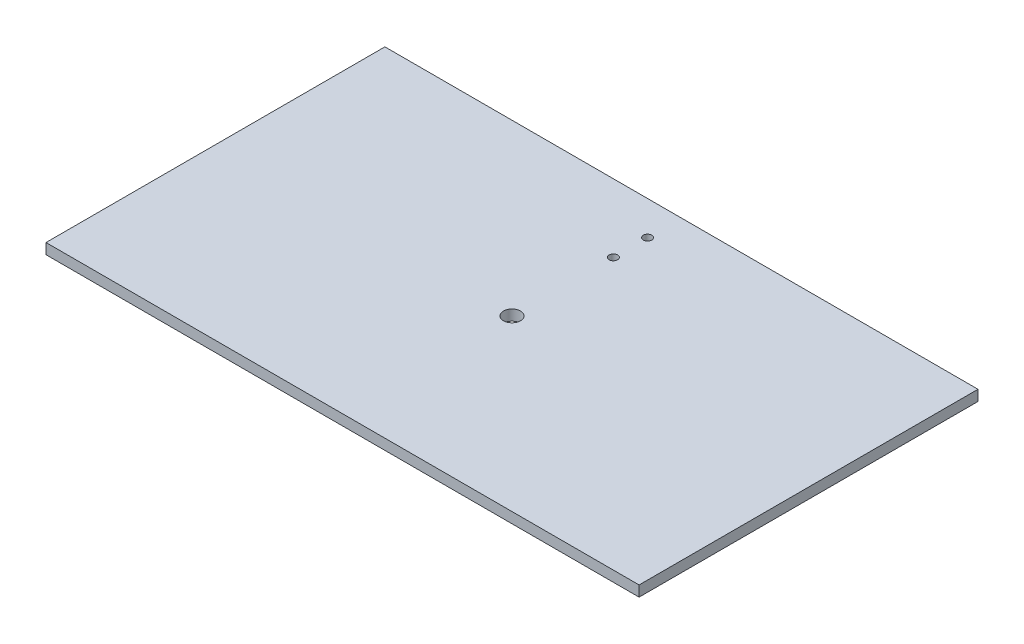
ISO-10303-21;
HEADER;
FILE_DESCRIPTION(('STEP AP214'),'2;1');
FILE_NAME('part.step','',(''),(''),'','','');
FILE_SCHEMA(('AUTOMOTIVE_DESIGN { 1 0 10303 214 1 1 1 1 }'));
ENDSEC;
DATA;
#1=APPLICATION_CONTEXT('core data for automotive mechanical design processes');
#2=APPLICATION_PROTOCOL_DEFINITION('international standard','automotive_design',2000,#1);
#3=PRODUCT_CONTEXT('',#1,'mechanical');
#4=PRODUCT('Part','Part','',(#3));
#5=PRODUCT_RELATED_PRODUCT_CATEGORY('part','',(#4));
#6=PRODUCT_DEFINITION_FORMATION('','',#4);
#7=PRODUCT_DEFINITION_CONTEXT('part definition',#1,'design');
#8=PRODUCT_DEFINITION('design','',#6,#7);
#9=PRODUCT_DEFINITION_SHAPE('','',#8);
#10=(LENGTH_UNIT() NAMED_UNIT(*) SI_UNIT(.MILLI.,.METRE.));
#11=(NAMED_UNIT(*) PLANE_ANGLE_UNIT() SI_UNIT($,.RADIAN.));
#12=(NAMED_UNIT(*) SI_UNIT($,.STERADIAN.) SOLID_ANGLE_UNIT());
#13=UNCERTAINTY_MEASURE_WITH_UNIT(LENGTH_MEASURE(1.E-05),#10,'distance_accuracy_value','');
#14=(GEOMETRIC_REPRESENTATION_CONTEXT(3) GLOBAL_UNCERTAINTY_ASSIGNED_CONTEXT((#13)) GLOBAL_UNIT_ASSIGNED_CONTEXT((#10,
#11,#12)) REPRESENTATION_CONTEXT('',''));
#15=CARTESIAN_POINT('',(0.,0.,0.));
#16=DIRECTION('',(0.,0.,1.));
#17=DIRECTION('',(1.,0.,0.));
#18=AXIS2_PLACEMENT_3D('',#15,#16,#17);
#19=CARTESIAN_POINT('',(177.8,6.35,101.6));
#20=DIRECTION('',(-1.,0.,0.));
#21=DIRECTION('',(0.,0.,1.));
#22=AXIS2_PLACEMENT_3D('',#19,#20,#21);
#23=PLANE('',#22);
#24=DIRECTION('',(0.,0.,-1.));
#25=VECTOR('',#24,1.);
#26=CARTESIAN_POINT('',(177.8,0.,101.6));
#27=LINE('',#26,#25);
#28=CARTESIAN_POINT('',(177.8,0.,101.6));
#29=VERTEX_POINT('',#28);
#30=CARTESIAN_POINT('',(177.8,0.,-101.6));
#31=VERTEX_POINT('',#30);
#32=EDGE_CURVE('E107',#29,#31,#27,.T.);
#33=ORIENTED_EDGE('',*,*,#32,.T.);
#34=DIRECTION('',(0.,-1.,0.));
#35=VECTOR('',#34,1.);
#36=CARTESIAN_POINT('',(177.8,6.35,-101.6));
#37=LINE('',#36,#35);
#38=CARTESIAN_POINT('',(177.8,6.35,-101.6));
#39=VERTEX_POINT('',#38);
#40=EDGE_CURVE('E11',#39,#31,#37,.T.);
#41=ORIENTED_EDGE('',*,*,#40,.F.);
#42=DIRECTION('',(0.,0.,-1.));
#43=VECTOR('',#42,1.);
#44=CARTESIAN_POINT('',(177.8,6.35,101.6));
#45=LINE('',#44,#43);
#46=CARTESIAN_POINT('',(177.8,6.35,101.6));
#47=VERTEX_POINT('',#46);
#48=EDGE_CURVE('E92',#47,#39,#45,.T.);
#49=ORIENTED_EDGE('',*,*,#48,.F.);
#50=DIRECTION('',(0.,-1.,0.));
#51=VECTOR('',#50,1.);
#52=CARTESIAN_POINT('',(177.8,6.35,101.6));
#53=LINE('',#52,#51);
#54=EDGE_CURVE('E102',#47,#29,#53,.T.);
#55=ORIENTED_EDGE('',*,*,#54,.T.);
#56=EDGE_LOOP('',(#33,#41,#49,#55));
#57=FACE_BOUND('',#56,.T.);
#58=ADVANCED_FACE('F43',(#57),#23,.F.);
#59=CARTESIAN_POINT('',(-177.8,6.35,-101.6));
#60=DIRECTION('',(0.,0.,1.));
#61=DIRECTION('',(1.,0.,0.));
#62=AXIS2_PLACEMENT_3D('',#59,#60,#61);
#63=PLANE('',#62);
#64=DIRECTION('',(-1.,0.,0.));
#65=VECTOR('',#64,1.);
#66=CARTESIAN_POINT('',(-177.8,0.,-101.6));
#67=LINE('',#66,#65);
#68=CARTESIAN_POINT('',(-177.8,0.,-101.6));
#69=VERTEX_POINT('',#68);
#70=EDGE_CURVE('E97',#31,#69,#67,.T.);
#71=ORIENTED_EDGE('',*,*,#70,.T.);
#72=DIRECTION('',(0.,-1.,0.));
#73=VECTOR('',#72,1.);
#74=CARTESIAN_POINT('',(-177.8,6.35,-101.6));
#75=LINE('',#74,#73);
#76=CARTESIAN_POINT('',(-177.8,6.35,-101.6));
#77=VERTEX_POINT('',#76);
#78=EDGE_CURVE('E55',#77,#69,#75,.T.);
#79=ORIENTED_EDGE('',*,*,#78,.F.);
#80=DIRECTION('',(-1.,0.,0.));
#81=VECTOR('',#80,1.);
#82=CARTESIAN_POINT('',(-177.8,6.35,-101.6));
#83=LINE('',#82,#81);
#84=EDGE_CURVE('E89',#39,#77,#83,.T.);
#85=ORIENTED_EDGE('',*,*,#84,.F.);
#86=ORIENTED_EDGE('',*,*,#40,.T.);
#87=EDGE_LOOP('',(#71,#79,#85,#86));
#88=FACE_BOUND('',#87,.T.);
#89=ADVANCED_FACE('F98',(#88),#63,.F.);
#90=CARTESIAN_POINT('',(-177.8,6.35,101.6));
#91=DIRECTION('',(1.,0.,0.));
#92=DIRECTION('',(0.,0.,-1.));
#93=AXIS2_PLACEMENT_3D('',#90,#91,#92);
#94=PLANE('',#93);
#95=DIRECTION('',(0.,0.,1.));
#96=VECTOR('',#95,1.);
#97=CARTESIAN_POINT('',(-177.8,0.,101.6));
#98=LINE('',#97,#96);
#99=CARTESIAN_POINT('',(-177.8,0.,101.6));
#100=VERTEX_POINT('',#99);
#101=EDGE_CURVE('E79',#69,#100,#98,.T.);
#102=ORIENTED_EDGE('',*,*,#101,.T.);
#103=DIRECTION('',(0.,-1.,0.));
#104=VECTOR('',#103,1.);
#105=CARTESIAN_POINT('',(-177.8,6.35,101.6));
#106=LINE('',#105,#104);
#107=CARTESIAN_POINT('',(-177.8,6.35,101.6));
#108=VERTEX_POINT('',#107);
#109=EDGE_CURVE('E99',#108,#100,#106,.T.);
#110=ORIENTED_EDGE('',*,*,#109,.F.);
#111=DIRECTION('',(0.,0.,1.));
#112=VECTOR('',#111,1.);
#113=CARTESIAN_POINT('',(-177.8,6.35,101.6));
#114=LINE('',#113,#112);
#115=EDGE_CURVE('E91',#77,#108,#114,.T.);
#116=ORIENTED_EDGE('',*,*,#115,.F.);
#117=ORIENTED_EDGE('',*,*,#78,.T.);
#118=EDGE_LOOP('',(#102,#110,#116,#117));
#119=FACE_BOUND('',#118,.T.);
#120=ADVANCED_FACE('F105',(#119),#94,.F.);
#121=CARTESIAN_POINT('',(-177.8,6.35,101.6));
#122=DIRECTION('',(0.,0.,-1.));
#123=DIRECTION('',(-1.,0.,0.));
#124=AXIS2_PLACEMENT_3D('',#121,#122,#123);
#125=PLANE('',#124);
#126=DIRECTION('',(1.,0.,0.));
#127=VECTOR('',#126,1.);
#128=CARTESIAN_POINT('',(-177.8,0.,101.6));
#129=LINE('',#128,#127);
#130=EDGE_CURVE('E81',#100,#29,#129,.T.);
#131=ORIENTED_EDGE('',*,*,#130,.T.);
#132=ORIENTED_EDGE('',*,*,#54,.F.);
#133=DIRECTION('',(1.,0.,0.));
#134=VECTOR('',#133,1.);
#135=CARTESIAN_POINT('',(-177.8,6.35,101.6));
#136=LINE('',#135,#134);
#137=EDGE_CURVE('E58',#108,#47,#136,.T.);
#138=ORIENTED_EDGE('',*,*,#137,.F.);
#139=ORIENTED_EDGE('',*,*,#109,.T.);
#140=EDGE_LOOP('',(#131,#132,#138,#139));
#141=FACE_BOUND('',#140,.T.);
#142=ADVANCED_FACE('F118',(#141),#125,.F.);
#143=CARTESIAN_POINT('',(0.,6.35,0.));
#144=DIRECTION('',(0.,-1.,0.));
#145=DIRECTION('',(0.,0.,-1.));
#146=AXIS2_PLACEMENT_3D('',#143,#144,#145);
#147=PLANE('',#146);
#148=CARTESIAN_POINT('',(0.,6.35,0.));
#149=DIRECTION('',(0.,1.,0.));
#150=DIRECTION('',(0.,0.,1.));
#151=AXIS2_PLACEMENT_3D('',#148,#149,#150);
#152=CIRCLE('',#151,5.09999999999999);
#153=CARTESIAN_POINT('',(0.,6.35,5.09999999999999));
#154=VERTEX_POINT('',#153);
#155=EDGE_CURVE('E132',#154,#154,#152,.T.);
#156=ORIENTED_EDGE('',*,*,#155,.F.);
#157=EDGE_LOOP('',(#156));
#158=FACE_BOUND('',#157,.T.);
#159=CARTESIAN_POINT('',(0.,6.35,-81.28));
#160=DIRECTION('',(0.,1.,0.));
#161=DIRECTION('',(0.,0.,1.));
#162=AXIS2_PLACEMENT_3D('',#159,#160,#161);
#163=CIRCLE('',#162,2.54);
#164=CARTESIAN_POINT('',(0.,6.35,-78.74));
#165=VERTEX_POINT('',#164);
#166=EDGE_CURVE('E126',#165,#165,#163,.T.);
#167=ORIENTED_EDGE('',*,*,#166,.F.);
#168=EDGE_LOOP('',(#167));
#169=FACE_BOUND('',#168,.T.);
#170=CARTESIAN_POINT('',(0.,6.35,-60.779914));
#171=DIRECTION('',(0.,1.,0.));
#172=DIRECTION('',(0.,0.,1.));
#173=AXIS2_PLACEMENT_3D('',#170,#171,#172);
#174=CIRCLE('',#173,2.54);
#175=CARTESIAN_POINT('',(0.,6.35,-58.239914));
#176=VERTEX_POINT('',#175);
#177=EDGE_CURVE('E122',#176,#176,#174,.T.);
#178=ORIENTED_EDGE('',*,*,#177,.F.);
#179=EDGE_LOOP('',(#178));
#180=FACE_BOUND('',#179,.T.);
#181=ORIENTED_EDGE('',*,*,#48,.T.);
#182=ORIENTED_EDGE('',*,*,#84,.T.);
#183=ORIENTED_EDGE('',*,*,#115,.T.);
#184=ORIENTED_EDGE('',*,*,#137,.T.);
#185=EDGE_LOOP('',(#181,#182,#183,#184));
#186=FACE_BOUND('',#185,.T.);
#187=ADVANCED_FACE('F93',(#158,#169,#180,#186),#147,.F.);
#188=CARTESIAN_POINT('',(0.,0.,0.));
#189=DIRECTION('',(0.,-1.,0.));
#190=DIRECTION('',(0.,0.,-1.));
#191=AXIS2_PLACEMENT_3D('',#188,#189,#190);
#192=PLANE('',#191);
#193=CARTESIAN_POINT('',(0.,0.,0.));
#194=DIRECTION('',(0.,-1.,0.));
#195=DIRECTION('',(0.,0.,-1.));
#196=AXIS2_PLACEMENT_3D('',#193,#194,#195);
#197=CIRCLE('',#196,5.09999999999999);
#198=CARTESIAN_POINT('',(0.,0.,-5.09999999999999));
#199=VERTEX_POINT('',#198);
#200=EDGE_CURVE('E46',#199,#199,#197,.T.);
#201=ORIENTED_EDGE('',*,*,#200,.F.);
#202=EDGE_LOOP('',(#201));
#203=FACE_BOUND('',#202,.T.);
#204=CARTESIAN_POINT('',(0.,0.,-81.28));
#205=DIRECTION('',(0.,1.,0.));
#206=DIRECTION('',(0.,0.,1.));
#207=AXIS2_PLACEMENT_3D('',#204,#205,#206);
#208=CIRCLE('',#207,2.54);
#209=CARTESIAN_POINT('',(0.,0.,-78.74));
#210=VERTEX_POINT('',#209);
#211=EDGE_CURVE('E112',#210,#210,#208,.T.);
#212=ORIENTED_EDGE('',*,*,#211,.T.);
#213=EDGE_LOOP('',(#212));
#214=FACE_BOUND('',#213,.T.);
#215=CARTESIAN_POINT('',(0.,0.,-60.779914));
#216=DIRECTION('',(0.,1.,0.));
#217=DIRECTION('',(0.,0.,1.));
#218=AXIS2_PLACEMENT_3D('',#215,#216,#217);
#219=CIRCLE('',#218,2.54);
#220=CARTESIAN_POINT('',(0.,0.,-58.239914));
#221=VERTEX_POINT('',#220);
#222=EDGE_CURVE('E125',#221,#221,#219,.T.);
#223=ORIENTED_EDGE('',*,*,#222,.T.);
#224=EDGE_LOOP('',(#223));
#225=FACE_BOUND('',#224,.T.);
#226=ORIENTED_EDGE('',*,*,#32,.F.);
#227=ORIENTED_EDGE('',*,*,#130,.F.);
#228=ORIENTED_EDGE('',*,*,#101,.F.);
#229=ORIENTED_EDGE('',*,*,#70,.F.);
#230=EDGE_LOOP('',(#226,#227,#228,#229));
#231=FACE_BOUND('',#230,.T.);
#232=ADVANCED_FACE('F120',(#203,#214,#225,#231),#192,.T.);
#233=CARTESIAN_POINT('',(0.,0.,-60.779914));
#234=DIRECTION('',(0.,1.,0.));
#235=DIRECTION('',(0.,0.,1.));
#236=AXIS2_PLACEMENT_3D('',#233,#234,#235);
#237=CYLINDRICAL_SURFACE('',#236,2.54);
#238=ORIENTED_EDGE('',*,*,#222,.F.);
#239=EDGE_LOOP('',(#238));
#240=FACE_BOUND('',#239,.T.);
#241=ORIENTED_EDGE('',*,*,#177,.T.);
#242=EDGE_LOOP('',(#241));
#243=FACE_BOUND('',#242,.T.);
#244=ADVANCED_FACE('F145',(#240,#243),#237,.F.);
#245=CARTESIAN_POINT('',(0.,0.,-81.28));
#246=DIRECTION('',(0.,1.,0.));
#247=DIRECTION('',(0.,0.,1.));
#248=AXIS2_PLACEMENT_3D('',#245,#246,#247);
#249=CYLINDRICAL_SURFACE('',#248,2.54);
#250=ORIENTED_EDGE('',*,*,#211,.F.);
#251=EDGE_LOOP('',(#250));
#252=FACE_BOUND('',#251,.T.);
#253=ORIENTED_EDGE('',*,*,#166,.T.);
#254=EDGE_LOOP('',(#253));
#255=FACE_BOUND('',#254,.T.);
#256=ADVANCED_FACE('F155',(#252,#255),#249,.F.);
#257=CARTESIAN_POINT('',(0.,6.35,0.));
#258=DIRECTION('',(0.,1.,0.));
#259=DIRECTION('',(0.,0.,1.));
#260=AXIS2_PLACEMENT_3D('',#257,#258,#259);
#261=CYLINDRICAL_SURFACE('',#260,5.09999999999999);
#262=ORIENTED_EDGE('',*,*,#200,.T.);
#263=EDGE_LOOP('',(#262));
#264=FACE_BOUND('',#263,.T.);
#265=ORIENTED_EDGE('',*,*,#155,.T.);
#266=EDGE_LOOP('',(#265));
#267=FACE_BOUND('',#266,.T.);
#268=ADVANCED_FACE('F137',(#264,#267),#261,.F.);
#269=CLOSED_SHELL('',(#58,#89,#120,#142,#187,#232,#244,#256,#268));
#270=MANIFOLD_SOLID_BREP('B2',#269);
#271=ADVANCED_BREP_SHAPE_REPRESENTATION('',(#18,#270),#14);
#272=SHAPE_DEFINITION_REPRESENTATION(#9,#271);
ENDSEC;
END-ISO-10303-21;
